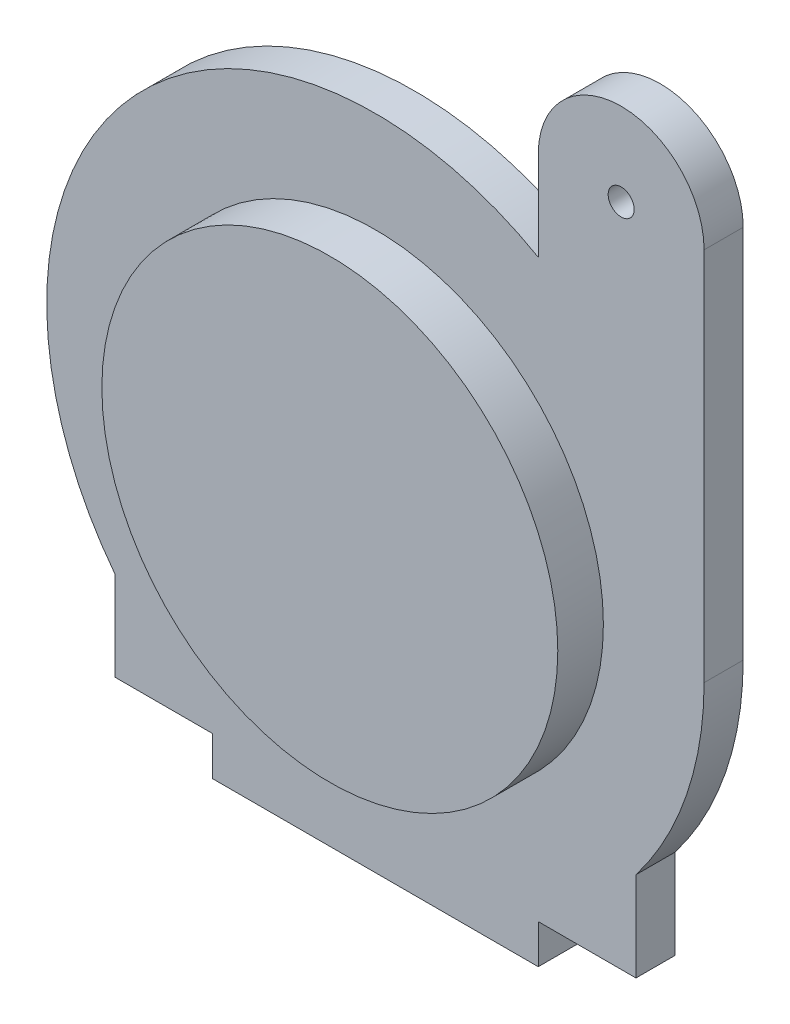
ISO-10303-21;
HEADER;
FILE_DESCRIPTION(('STEP AP214'),'2;1');
FILE_NAME('part.step','',(''),(''),'','','');
FILE_SCHEMA(('AUTOMOTIVE_DESIGN { 1 0 10303 214 1 1 1 1 }'));
ENDSEC;
DATA;
#1=APPLICATION_CONTEXT('core data for automotive mechanical design processes');
#2=APPLICATION_PROTOCOL_DEFINITION('international standard','automotive_design',2000,#1);
#3=PRODUCT_CONTEXT('',#1,'mechanical');
#4=PRODUCT('Part','Part','',(#3));
#5=PRODUCT_RELATED_PRODUCT_CATEGORY('part','',(#4));
#6=PRODUCT_DEFINITION_FORMATION('','',#4);
#7=PRODUCT_DEFINITION_CONTEXT('part definition',#1,'design');
#8=PRODUCT_DEFINITION('design','',#6,#7);
#9=PRODUCT_DEFINITION_SHAPE('','',#8);
#10=(LENGTH_UNIT() NAMED_UNIT(*) SI_UNIT(.MILLI.,.METRE.));
#11=(NAMED_UNIT(*) PLANE_ANGLE_UNIT() SI_UNIT($,.RADIAN.));
#12=(NAMED_UNIT(*) SI_UNIT($,.STERADIAN.) SOLID_ANGLE_UNIT());
#13=UNCERTAINTY_MEASURE_WITH_UNIT(LENGTH_MEASURE(1.E-05),#10,'distance_accuracy_value','');
#14=(GEOMETRIC_REPRESENTATION_CONTEXT(3) GLOBAL_UNCERTAINTY_ASSIGNED_CONTEXT((#13)) GLOBAL_UNIT_ASSIGNED_CONTEXT((#10,
#11,#12)) REPRESENTATION_CONTEXT('',''));
#15=CARTESIAN_POINT('',(0.,0.,0.));
#16=DIRECTION('',(0.,0.,1.));
#17=DIRECTION('',(1.,0.,0.));
#18=AXIS2_PLACEMENT_3D('',#15,#16,#17);
#19=CARTESIAN_POINT('',(0.,0.,3.));
#20=DIRECTION('',(0.,1.,0.));
#21=DIRECTION('',(0.,0.,1.));
#22=AXIS2_PLACEMENT_3D('',#19,#20,#21);
#23=PLANE('',#22);
#24=DIRECTION('',(1.,0.,0.));
#25=VECTOR('',#24,1.);
#26=CARTESIAN_POINT('',(0.,0.,0.));
#27=LINE('',#26,#25);
#28=CARTESIAN_POINT('',(0.,0.,0.));
#29=VERTEX_POINT('',#28);
#30=CARTESIAN_POINT('',(7.5,0.,0.));
#31=VERTEX_POINT('',#30);
#32=EDGE_CURVE('E163',#29,#31,#27,.T.);
#33=ORIENTED_EDGE('',*,*,#32,.T.);
#34=DIRECTION('',(0.,0.,-1.));
#35=VECTOR('',#34,1.);
#36=CARTESIAN_POINT('',(7.5,0.,3.));
#37=LINE('',#36,#35);
#38=CARTESIAN_POINT('',(7.5,0.,3.));
#39=VERTEX_POINT('',#38);
#40=EDGE_CURVE('E39',#39,#31,#37,.T.);
#41=ORIENTED_EDGE('',*,*,#40,.F.);
#42=DIRECTION('',(1.,0.,0.));
#43=VECTOR('',#42,1.);
#44=CARTESIAN_POINT('',(0.,0.,3.));
#45=LINE('',#44,#43);
#46=CARTESIAN_POINT('',(0.,0.,3.));
#47=VERTEX_POINT('',#46);
#48=EDGE_CURVE('E278',#47,#39,#45,.T.);
#49=ORIENTED_EDGE('',*,*,#48,.F.);
#50=DIRECTION('',(0.,0.,-1.));
#51=VECTOR('',#50,1.);
#52=CARTESIAN_POINT('',(0.,0.,3.));
#53=LINE('',#52,#51);
#54=EDGE_CURVE('E53',#47,#29,#53,.T.);
#55=ORIENTED_EDGE('',*,*,#54,.T.);
#56=EDGE_LOOP('',(#33,#41,#49,#55));
#57=FACE_BOUND('',#56,.T.);
#58=ADVANCED_FACE('F35',(#57),#23,.F.);
#59=CARTESIAN_POINT('',(7.5,0.,3.));
#60=DIRECTION('',(1.,0.,0.));
#61=DIRECTION('',(0.,0.,-1.));
#62=AXIS2_PLACEMENT_3D('',#59,#60,#61);
#63=PLANE('',#62);
#64=DIRECTION('',(0.,-1.,0.));
#65=VECTOR('',#64,1.);
#66=CARTESIAN_POINT('',(7.5,0.,0.));
#67=LINE('',#66,#65);
#68=CARTESIAN_POINT('',(7.5,-3.,0.));
#69=VERTEX_POINT('',#68);
#70=EDGE_CURVE('E166',#31,#69,#67,.T.);
#71=ORIENTED_EDGE('',*,*,#70,.T.);
#72=DIRECTION('',(0.,0.,-1.));
#73=VECTOR('',#72,1.);
#74=CARTESIAN_POINT('',(7.5,-3.,3.));
#75=LINE('',#74,#73);
#76=CARTESIAN_POINT('',(7.5,-3.,3.));
#77=VERTEX_POINT('',#76);
#78=EDGE_CURVE('E209',#77,#69,#75,.T.);
#79=ORIENTED_EDGE('',*,*,#78,.F.);
#80=DIRECTION('',(0.,-1.,0.));
#81=VECTOR('',#80,1.);
#82=CARTESIAN_POINT('',(7.5,0.,3.));
#83=LINE('',#82,#81);
#84=EDGE_CURVE('E105',#39,#77,#83,.T.);
#85=ORIENTED_EDGE('',*,*,#84,.F.);
#86=ORIENTED_EDGE('',*,*,#40,.T.);
#87=EDGE_LOOP('',(#71,#79,#85,#86));
#88=FACE_BOUND('',#87,.T.);
#89=ADVANCED_FACE('F215',(#88),#63,.F.);
#90=CARTESIAN_POINT('',(0.,-3.,3.));
#91=DIRECTION('',(0.,1.,0.));
#92=DIRECTION('',(0.,0.,1.));
#93=AXIS2_PLACEMENT_3D('',#90,#91,#92);
#94=PLANE('',#93);
#95=DIRECTION('',(1.,0.,0.));
#96=VECTOR('',#95,1.);
#97=CARTESIAN_POINT('',(0.,-3.,0.));
#98=LINE('',#97,#96);
#99=CARTESIAN_POINT('',(32.5,-3.,0.));
#100=VERTEX_POINT('',#99);
#101=EDGE_CURVE('E169',#69,#100,#98,.T.);
#102=ORIENTED_EDGE('',*,*,#101,.T.);
#103=DIRECTION('',(0.,0.,-1.));
#104=VECTOR('',#103,1.);
#105=CARTESIAN_POINT('',(32.5,-3.,3.));
#106=LINE('',#105,#104);
#107=CARTESIAN_POINT('',(32.5,-3.,3.));
#108=VERTEX_POINT('',#107);
#109=EDGE_CURVE('E207',#108,#100,#106,.T.);
#110=ORIENTED_EDGE('',*,*,#109,.F.);
#111=DIRECTION('',(1.,0.,0.));
#112=VECTOR('',#111,1.);
#113=CARTESIAN_POINT('',(0.,-3.,3.));
#114=LINE('',#113,#112);
#115=EDGE_CURVE('E275',#77,#108,#114,.T.);
#116=ORIENTED_EDGE('',*,*,#115,.F.);
#117=ORIENTED_EDGE('',*,*,#78,.T.);
#118=EDGE_LOOP('',(#102,#110,#116,#117));
#119=FACE_BOUND('',#118,.T.);
#120=ADVANCED_FACE('F236',(#119),#94,.F.);
#121=CARTESIAN_POINT('',(32.5,0.,3.));
#122=DIRECTION('',(-1.,0.,0.));
#123=DIRECTION('',(0.,0.,1.));
#124=AXIS2_PLACEMENT_3D('',#121,#122,#123);
#125=PLANE('',#124);
#126=DIRECTION('',(0.,1.,0.));
#127=VECTOR('',#126,1.);
#128=CARTESIAN_POINT('',(32.5,0.,0.));
#129=LINE('',#128,#127);
#130=CARTESIAN_POINT('',(32.5,0.,0.));
#131=VERTEX_POINT('',#130);
#132=EDGE_CURVE('E171',#100,#131,#129,.T.);
#133=ORIENTED_EDGE('',*,*,#132,.T.);
#134=DIRECTION('',(0.,0.,-1.));
#135=VECTOR('',#134,1.);
#136=CARTESIAN_POINT('',(32.5,0.,3.));
#137=LINE('',#136,#135);
#138=CARTESIAN_POINT('',(32.5,0.,3.));
#139=VERTEX_POINT('',#138);
#140=EDGE_CURVE('E204',#139,#131,#137,.T.);
#141=ORIENTED_EDGE('',*,*,#140,.F.);
#142=DIRECTION('',(0.,1.,0.));
#143=VECTOR('',#142,1.);
#144=CARTESIAN_POINT('',(32.5,0.,3.));
#145=LINE('',#144,#143);
#146=EDGE_CURVE('E273',#108,#139,#145,.T.);
#147=ORIENTED_EDGE('',*,*,#146,.F.);
#148=ORIENTED_EDGE('',*,*,#109,.T.);
#149=EDGE_LOOP('',(#133,#141,#147,#148));
#150=FACE_BOUND('',#149,.T.);
#151=ADVANCED_FACE('F241',(#150),#125,.F.);
#152=CARTESIAN_POINT('',(40.,0.,0.));
#153=VERTEX_POINT('',#152);
#154=EDGE_CURVE('E167',#131,#153,#27,.T.);
#155=ORIENTED_EDGE('',*,*,#154,.T.);
#156=DIRECTION('',(0.,0.,-1.));
#157=VECTOR('',#156,1.);
#158=CARTESIAN_POINT('',(40.,0.,3.));
#159=LINE('',#158,#157);
#160=CARTESIAN_POINT('',(40.,0.,3.));
#161=VERTEX_POINT('',#160);
#162=EDGE_CURVE('E201',#161,#153,#159,.T.);
#163=ORIENTED_EDGE('',*,*,#162,.F.);
#164=EDGE_CURVE('E272',#139,#161,#45,.T.);
#165=ORIENTED_EDGE('',*,*,#164,.F.);
#166=ORIENTED_EDGE('',*,*,#140,.T.);
#167=EDGE_LOOP('',(#155,#163,#165,#166));
#168=FACE_BOUND('',#167,.T.);
#169=ADVANCED_FACE('F232',(#168),#23,.F.);
#170=CARTESIAN_POINT('',(40.,0.,3.));
#171=DIRECTION('',(-1.,0.,0.));
#172=DIRECTION('',(0.,0.,1.));
#173=AXIS2_PLACEMENT_3D('',#170,#171,#172);
#174=PLANE('',#173);
#175=DIRECTION('',(0.,1.,0.));
#176=VECTOR('',#175,1.);
#177=CARTESIAN_POINT('',(40.,0.,0.));
#178=LINE('',#177,#176);
#179=CARTESIAN_POINT('',(40.,6.86708178730772,0.));
#180=VERTEX_POINT('',#179);
#181=EDGE_CURVE('E173',#153,#180,#178,.T.);
#182=ORIENTED_EDGE('',*,*,#181,.T.);
#183=DIRECTION('',(0.,0.,-1.));
#184=VECTOR('',#183,1.);
#185=CARTESIAN_POINT('',(40.,6.86708178730772,3.));
#186=LINE('',#185,#184);
#187=CARTESIAN_POINT('',(40.,6.86708178730772,3.));
#188=VERTEX_POINT('',#187);
#189=EDGE_CURVE('E198',#188,#180,#186,.T.);
#190=ORIENTED_EDGE('',*,*,#189,.F.);
#191=DIRECTION('',(0.,1.,0.));
#192=VECTOR('',#191,1.);
#193=CARTESIAN_POINT('',(40.,0.,3.));
#194=LINE('',#193,#192);
#195=EDGE_CURVE('E258',#161,#188,#194,.T.);
#196=ORIENTED_EDGE('',*,*,#195,.F.);
#197=ORIENTED_EDGE('',*,*,#162,.T.);
#198=EDGE_LOOP('',(#182,#190,#196,#197));
#199=FACE_BOUND('',#198,.T.);
#200=ADVANCED_FACE('F240',(#199),#174,.F.);
#201=CARTESIAN_POINT('',(20.,22.2498705071397,3.));
#202=DIRECTION('',(0.,0.,-1.));
#203=DIRECTION('',(-1.,0.,0.));
#204=AXIS2_PLACEMENT_3D('',#201,#202,#203);
#205=CYLINDRICAL_SURFACE('',#204,25.231531637992);
#206=CARTESIAN_POINT('',(20.,22.2498705071397,0.));
#207=DIRECTION('',(0.,0.,1.));
#208=DIRECTION('',(1.,0.,0.));
#209=AXIS2_PLACEMENT_3D('',#206,#207,#208);
#210=CIRCLE('',#209,25.231531637992);
#211=CARTESIAN_POINT('',(45.231531637992,22.2498705071397,0.));
#212=VERTEX_POINT('',#211);
#213=EDGE_CURVE('E175',#180,#212,#210,.T.);
#214=ORIENTED_EDGE('',*,*,#213,.T.);
#215=DIRECTION('',(0.,0.,-1.));
#216=VECTOR('',#215,1.);
#217=CARTESIAN_POINT('',(45.231531637992,22.2498705071397,3.));
#218=LINE('',#217,#216);
#219=CARTESIAN_POINT('',(45.231531637992,22.2498705071397,3.));
#220=VERTEX_POINT('',#219);
#221=EDGE_CURVE('E195',#220,#212,#218,.T.);
#222=ORIENTED_EDGE('',*,*,#221,.F.);
#223=CARTESIAN_POINT('',(20.,22.2498705071397,3.));
#224=DIRECTION('',(0.,0.,1.));
#225=DIRECTION('',(1.,0.,0.));
#226=AXIS2_PLACEMENT_3D('',#223,#224,#225);
#227=CIRCLE('',#226,25.231531637992);
#228=EDGE_CURVE('E268',#188,#220,#227,.T.);
#229=ORIENTED_EDGE('',*,*,#228,.F.);
#230=ORIENTED_EDGE('',*,*,#189,.T.);
#231=EDGE_LOOP('',(#214,#222,#229,#230));
#232=FACE_BOUND('',#231,.T.);
#233=ADVANCED_FACE('F247',(#232),#205,.T.);
#234=CARTESIAN_POINT('',(45.231531637992,0.,3.));
#235=DIRECTION('',(-1.,0.,0.));
#236=DIRECTION('',(0.,0.,1.));
#237=AXIS2_PLACEMENT_3D('',#234,#235,#236);
#238=PLANE('',#237);
#239=DIRECTION('',(0.,1.,0.));
#240=VECTOR('',#239,1.);
#241=CARTESIAN_POINT('',(45.231531637992,0.,0.));
#242=LINE('',#241,#240);
#243=CARTESIAN_POINT('',(45.231531637992,51.0238573480053,0.));
#244=VERTEX_POINT('',#243);
#245=EDGE_CURVE('E177',#212,#244,#242,.T.);
#246=ORIENTED_EDGE('',*,*,#245,.T.);
#247=DIRECTION('',(0.,0.,-1.));
#248=VECTOR('',#247,1.);
#249=CARTESIAN_POINT('',(45.231531637992,51.0238573480053,3.));
#250=LINE('',#249,#248);
#251=CARTESIAN_POINT('',(45.231531637992,51.0238573480053,3.));
#252=VERTEX_POINT('',#251);
#253=EDGE_CURVE('E193',#252,#244,#250,.T.);
#254=ORIENTED_EDGE('',*,*,#253,.F.);
#255=DIRECTION('',(0.,1.,0.));
#256=VECTOR('',#255,1.);
#257=CARTESIAN_POINT('',(45.231531637992,0.,3.));
#258=LINE('',#257,#256);
#259=EDGE_CURVE('E155',#220,#252,#258,.T.);
#260=ORIENTED_EDGE('',*,*,#259,.F.);
#261=ORIENTED_EDGE('',*,*,#221,.T.);
#262=EDGE_LOOP('',(#246,#254,#260,#261));
#263=FACE_BOUND('',#262,.T.);
#264=ADVANCED_FACE('F266',(#263),#238,.F.);
#265=CARTESIAN_POINT('',(38.865765818996,51.0238573480053,3.));
#266=DIRECTION('',(0.,0.,-1.));
#267=DIRECTION('',(-1.,0.,0.));
#268=AXIS2_PLACEMENT_3D('',#265,#266,#267);
#269=CYLINDRICAL_SURFACE('',#268,6.36576581899599);
#270=CARTESIAN_POINT('',(38.865765818996,51.0238573480053,0.));
#271=DIRECTION('',(0.,0.,1.));
#272=DIRECTION('',(1.,0.,0.));
#273=AXIS2_PLACEMENT_3D('',#270,#271,#272);
#274=CIRCLE('',#273,6.36576581899599);
#275=CARTESIAN_POINT('',(32.5,51.0238573480053,0.));
#276=VERTEX_POINT('',#275);
#277=EDGE_CURVE('E180',#276,#244,#274,.F.);
#278=ORIENTED_EDGE('',*,*,#277,.F.);
#279=DIRECTION('',(0.,0.,-1.));
#280=VECTOR('',#279,1.);
#281=CARTESIAN_POINT('',(32.5,51.0238573480053,3.));
#282=LINE('',#281,#280);
#283=CARTESIAN_POINT('',(32.5,51.0238573480053,3.));
#284=VERTEX_POINT('',#283);
#285=EDGE_CURVE('E142',#284,#276,#282,.T.);
#286=ORIENTED_EDGE('',*,*,#285,.F.);
#287=CARTESIAN_POINT('',(38.865765818996,51.0238573480053,3.));
#288=DIRECTION('',(0.,0.,1.));
#289=DIRECTION('',(1.,0.,0.));
#290=AXIS2_PLACEMENT_3D('',#287,#288,#289);
#291=CIRCLE('',#290,6.36576581899599);
#292=EDGE_CURVE('E153',#284,#252,#291,.F.);
#293=ORIENTED_EDGE('',*,*,#292,.T.);
#294=ORIENTED_EDGE('',*,*,#253,.T.);
#295=EDGE_LOOP('',(#278,#286,#293,#294));
#296=FACE_BOUND('',#295,.T.);
#297=ADVANCED_FACE('F334',(#296),#269,.T.);
#298=CARTESIAN_POINT('',(32.5,0.,3.));
#299=DIRECTION('',(-1.,0.,0.));
#300=DIRECTION('',(0.,0.,1.));
#301=AXIS2_PLACEMENT_3D('',#298,#299,#300);
#302=PLANE('',#301);
#303=DIRECTION('',(0.,1.,0.));
#304=VECTOR('',#303,1.);
#305=CARTESIAN_POINT('',(32.5,0.,0.));
#306=LINE('',#305,#304);
#307=CARTESIAN_POINT('',(32.5,44.1674476724878,0.));
#308=VERTEX_POINT('',#307);
#309=EDGE_CURVE('E139',#308,#276,#306,.T.);
#310=ORIENTED_EDGE('',*,*,#309,.F.);
#311=DIRECTION('',(0.,0.,-1.));
#312=VECTOR('',#311,1.);
#313=CARTESIAN_POINT('',(32.5,44.1674476724878,3.));
#314=LINE('',#313,#312);
#315=CARTESIAN_POINT('',(32.5,44.1674476724878,3.));
#316=VERTEX_POINT('',#315);
#317=EDGE_CURVE('E133',#316,#308,#314,.T.);
#318=ORIENTED_EDGE('',*,*,#317,.F.);
#319=DIRECTION('',(0.,1.,0.));
#320=VECTOR('',#319,1.);
#321=CARTESIAN_POINT('',(32.5,0.,3.));
#322=LINE('',#321,#320);
#323=EDGE_CURVE('E137',#316,#284,#322,.T.);
#324=ORIENTED_EDGE('',*,*,#323,.T.);
#325=ORIENTED_EDGE('',*,*,#285,.T.);
#326=EDGE_LOOP('',(#310,#318,#324,#325));
#327=FACE_BOUND('',#326,.T.);
#328=ADVANCED_FACE('F135',(#327),#302,.T.);
#329=CARTESIAN_POINT('',(20.,22.2498705071397,3.));
#330=DIRECTION('',(0.,0.,-1.));
#331=DIRECTION('',(-1.,0.,0.));
#332=AXIS2_PLACEMENT_3D('',#329,#330,#331);
#333=CYLINDRICAL_SURFACE('',#332,25.231531637992);
#334=CARTESIAN_POINT('',(20.,22.2498705071397,0.));
#335=DIRECTION('',(0.,0.,1.));
#336=DIRECTION('',(1.,0.,0.));
#337=AXIS2_PLACEMENT_3D('',#334,#335,#336);
#338=CIRCLE('',#337,25.231531637992);
#339=CARTESIAN_POINT('',(0.,6.86708178730772,0.));
#340=VERTEX_POINT('',#339);
#341=EDGE_CURVE('E184',#308,#340,#338,.T.);
#342=ORIENTED_EDGE('',*,*,#341,.T.);
#343=DIRECTION('',(0.,0.,-1.));
#344=VECTOR('',#343,1.);
#345=CARTESIAN_POINT('',(0.,6.86708178730772,3.));
#346=LINE('',#345,#344);
#347=CARTESIAN_POINT('',(0.,6.86708178730772,3.));
#348=VERTEX_POINT('',#347);
#349=EDGE_CURVE('E92',#348,#340,#346,.T.);
#350=ORIENTED_EDGE('',*,*,#349,.F.);
#351=CARTESIAN_POINT('',(20.,22.2498705071397,3.));
#352=DIRECTION('',(0.,0.,1.));
#353=DIRECTION('',(1.,0.,0.));
#354=AXIS2_PLACEMENT_3D('',#351,#352,#353);
#355=CIRCLE('',#354,25.231531637992);
#356=EDGE_CURVE('E144',#316,#348,#355,.T.);
#357=ORIENTED_EDGE('',*,*,#356,.F.);
#358=ORIENTED_EDGE('',*,*,#317,.T.);
#359=EDGE_LOOP('',(#342,#350,#357,#358));
#360=FACE_BOUND('',#359,.T.);
#361=ADVANCED_FACE('F145',(#360),#333,.T.);
#362=CARTESIAN_POINT('',(38.865765818996,51.0238573480053,3.));
#363=DIRECTION('',(0.,0.,-1.));
#364=DIRECTION('',(-1.,0.,0.));
#365=AXIS2_PLACEMENT_3D('',#362,#363,#364);
#366=CYLINDRICAL_SURFACE('',#365,0.999999999999998);
#367=CARTESIAN_POINT('',(38.865765818996,51.0238573480053,3.));
#368=DIRECTION('',(0.,0.,1.));
#369=DIRECTION('',(1.,0.,0.));
#370=AXIS2_PLACEMENT_3D('',#367,#368,#369);
#371=CIRCLE('',#370,0.999999999999998);
#372=CARTESIAN_POINT('',(39.865765818996,51.0238573480053,3.));
#373=VERTEX_POINT('',#372);
#374=EDGE_CURVE('E189',#373,#373,#371,.T.);
#375=ORIENTED_EDGE('',*,*,#374,.T.);
#376=EDGE_LOOP('',(#375));
#377=FACE_BOUND('',#376,.T.);
#378=CARTESIAN_POINT('',(38.865765818996,51.0238573480053,0.));
#379=DIRECTION('',(0.,0.,1.));
#380=DIRECTION('',(1.,0.,0.));
#381=AXIS2_PLACEMENT_3D('',#378,#379,#380);
#382=CIRCLE('',#381,0.999999999999998);
#383=CARTESIAN_POINT('',(39.865765818996,51.0238573480053,0.));
#384=VERTEX_POINT('',#383);
#385=EDGE_CURVE('E160',#384,#384,#382,.T.);
#386=ORIENTED_EDGE('',*,*,#385,.F.);
#387=EDGE_LOOP('',(#386));
#388=FACE_BOUND('',#387,.T.);
#389=ADVANCED_FACE('F37',(#377,#388),#366,.F.);
#390=CARTESIAN_POINT('',(0.,0.,3.));
#391=DIRECTION('',(-1.,0.,0.));
#392=DIRECTION('',(0.,0.,1.));
#393=AXIS2_PLACEMENT_3D('',#390,#391,#392);
#394=PLANE('',#393);
#395=DIRECTION('',(0.,1.,0.));
#396=VECTOR('',#395,1.);
#397=CARTESIAN_POINT('',(0.,0.,0.));
#398=LINE('',#397,#396);
#399=EDGE_CURVE('E186',#29,#340,#398,.T.);
#400=ORIENTED_EDGE('',*,*,#399,.F.);
#401=ORIENTED_EDGE('',*,*,#54,.F.);
#402=DIRECTION('',(0.,1.,0.));
#403=VECTOR('',#402,1.);
#404=CARTESIAN_POINT('',(0.,0.,3.));
#405=LINE('',#404,#403);
#406=EDGE_CURVE('E148',#47,#348,#405,.T.);
#407=ORIENTED_EDGE('',*,*,#406,.T.);
#408=ORIENTED_EDGE('',*,*,#349,.T.);
#409=EDGE_LOOP('',(#400,#401,#407,#408));
#410=FACE_BOUND('',#409,.T.);
#411=ADVANCED_FACE('F218',(#410),#394,.T.);
#412=CARTESIAN_POINT('',(0.,0.,3.));
#413=DIRECTION('',(0.,0.,1.));
#414=DIRECTION('',(1.,0.,0.));
#415=AXIS2_PLACEMENT_3D('',#412,#413,#414);
#416=PLANE('',#415);
#417=CARTESIAN_POINT('',(20.,22.2498705071397,3.));
#418=DIRECTION('',(0.,0.,1.));
#419=DIRECTION('',(1.,0.,0.));
#420=AXIS2_PLACEMENT_3D('',#417,#418,#419);
#421=CIRCLE('',#420,17.5);
#422=CARTESIAN_POINT('',(37.5,22.2498705071397,3.));
#423=VERTEX_POINT('',#422);
#424=EDGE_CURVE('E11',#423,#423,#421,.T.);
#425=ORIENTED_EDGE('',*,*,#424,.F.);
#426=EDGE_LOOP('',(#425));
#427=FACE_BOUND('',#426,.T.);
#428=ORIENTED_EDGE('',*,*,#374,.F.);
#429=EDGE_LOOP('',(#428));
#430=FACE_BOUND('',#429,.T.);
#431=ORIENTED_EDGE('',*,*,#48,.T.);
#432=ORIENTED_EDGE('',*,*,#84,.T.);
#433=ORIENTED_EDGE('',*,*,#115,.T.);
#434=ORIENTED_EDGE('',*,*,#146,.T.);
#435=ORIENTED_EDGE('',*,*,#164,.T.);
#436=ORIENTED_EDGE('',*,*,#195,.T.);
#437=ORIENTED_EDGE('',*,*,#228,.T.);
#438=ORIENTED_EDGE('',*,*,#259,.T.);
#439=ORIENTED_EDGE('',*,*,#292,.F.);
#440=ORIENTED_EDGE('',*,*,#323,.F.);
#441=ORIENTED_EDGE('',*,*,#356,.T.);
#442=ORIENTED_EDGE('',*,*,#406,.F.);
#443=EDGE_LOOP('',(#431,#432,#433,#434,#435,#436,#437,#438,#439,#440,#441,#442));
#444=FACE_BOUND('',#443,.T.);
#445=ADVANCED_FACE('F151',(#427,#430,#444),#416,.T.);
#446=CARTESIAN_POINT('',(0.,0.,0.));
#447=DIRECTION('',(0.,0.,1.));
#448=DIRECTION('',(1.,0.,0.));
#449=AXIS2_PLACEMENT_3D('',#446,#447,#448);
#450=PLANE('',#449);
#451=ORIENTED_EDGE('',*,*,#385,.T.);
#452=EDGE_LOOP('',(#451));
#453=FACE_BOUND('',#452,.T.);
#454=ORIENTED_EDGE('',*,*,#32,.F.);
#455=ORIENTED_EDGE('',*,*,#399,.T.);
#456=ORIENTED_EDGE('',*,*,#341,.F.);
#457=ORIENTED_EDGE('',*,*,#309,.T.);
#458=ORIENTED_EDGE('',*,*,#277,.T.);
#459=ORIENTED_EDGE('',*,*,#245,.F.);
#460=ORIENTED_EDGE('',*,*,#213,.F.);
#461=ORIENTED_EDGE('',*,*,#181,.F.);
#462=ORIENTED_EDGE('',*,*,#154,.F.);
#463=ORIENTED_EDGE('',*,*,#132,.F.);
#464=ORIENTED_EDGE('',*,*,#101,.F.);
#465=ORIENTED_EDGE('',*,*,#70,.F.);
#466=EDGE_LOOP('',(#454,#455,#456,#457,#458,#459,#460,#461,#462,#463,#464,#465));
#467=FACE_BOUND('',#466,.T.);
#468=ADVANCED_FACE('F217',(#453,#467),#450,.F.);
#469=CARTESIAN_POINT('',(20.,22.2498705071397,6.5));
#470=DIRECTION('',(0.,0.,-1.));
#471=DIRECTION('',(-1.,0.,0.));
#472=AXIS2_PLACEMENT_3D('',#469,#470,#471);
#473=PLANE('',#472);
#474=CARTESIAN_POINT('',(20.,22.2498705071397,6.5));
#475=DIRECTION('',(0.,0.,-1.));
#476=DIRECTION('',(-1.,0.,0.));
#477=AXIS2_PLACEMENT_3D('',#474,#475,#476);
#478=CIRCLE('',#477,17.5);
#479=CARTESIAN_POINT('',(2.5,22.2498705071397,6.5));
#480=VERTEX_POINT('',#479);
#481=EDGE_CURVE('E164',#480,#480,#478,.T.);
#482=ORIENTED_EDGE('',*,*,#481,.F.);
#483=EDGE_LOOP('',(#482));
#484=FACE_BOUND('',#483,.T.);
#485=ADVANCED_FACE('F287',(#484),#473,.F.);
#486=CARTESIAN_POINT('',(20.,22.2498705071397,6.5));
#487=DIRECTION('',(0.,0.,-1.));
#488=DIRECTION('',(-1.,0.,0.));
#489=AXIS2_PLACEMENT_3D('',#486,#487,#488);
#490=CYLINDRICAL_SURFACE('',#489,17.5);
#491=ORIENTED_EDGE('',*,*,#424,.T.);
#492=EDGE_LOOP('',(#491));
#493=FACE_BOUND('',#492,.T.);
#494=ORIENTED_EDGE('',*,*,#481,.T.);
#495=EDGE_LOOP('',(#494));
#496=FACE_BOUND('',#495,.T.);
#497=ADVANCED_FACE('F285',(#493,#496),#490,.T.);
#498=CLOSED_SHELL('',(#58,#89,#120,#151,#169,#200,#233,#264,#297,#328,#361,#389,#411,#445,#468,
#485,#497));
#499=MANIFOLD_SOLID_BREP('B2',#498);
#500=ADVANCED_BREP_SHAPE_REPRESENTATION('',(#18,#499),#14);
#501=SHAPE_DEFINITION_REPRESENTATION(#9,#500);
ENDSEC;
END-ISO-10303-21;
